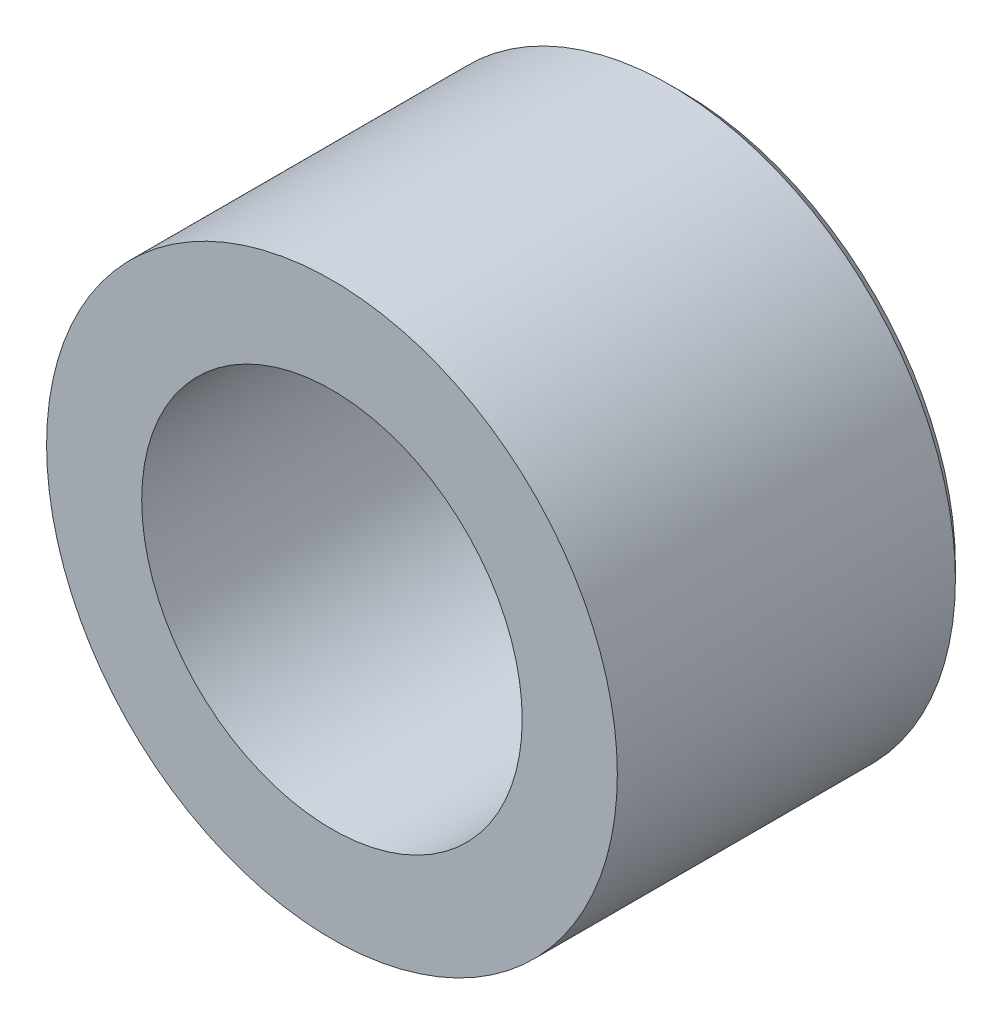
ISO-10303-21;
HEADER;
FILE_DESCRIPTION(('STEP AP214'),'2;1');
FILE_NAME('part.step','',(''),(''),'','','');
FILE_SCHEMA(('AUTOMOTIVE_DESIGN { 1 0 10303 214 1 1 1 1 }'));
ENDSEC;
DATA;
#1=APPLICATION_CONTEXT('core data for automotive mechanical design processes');
#2=APPLICATION_PROTOCOL_DEFINITION('international standard','automotive_design',2000,#1);
#3=PRODUCT_CONTEXT('',#1,'mechanical');
#4=PRODUCT('Part','Part','',(#3));
#5=PRODUCT_RELATED_PRODUCT_CATEGORY('part','',(#4));
#6=PRODUCT_DEFINITION_FORMATION('','',#4);
#7=PRODUCT_DEFINITION_CONTEXT('part definition',#1,'design');
#8=PRODUCT_DEFINITION('design','',#6,#7);
#9=PRODUCT_DEFINITION_SHAPE('','',#8);
#10=(LENGTH_UNIT() NAMED_UNIT(*) SI_UNIT(.MILLI.,.METRE.));
#11=(NAMED_UNIT(*) PLANE_ANGLE_UNIT() SI_UNIT($,.RADIAN.));
#12=(NAMED_UNIT(*) SI_UNIT($,.STERADIAN.) SOLID_ANGLE_UNIT());
#13=UNCERTAINTY_MEASURE_WITH_UNIT(LENGTH_MEASURE(1.E-05),#10,'distance_accuracy_value','');
#14=(GEOMETRIC_REPRESENTATION_CONTEXT(3) GLOBAL_UNCERTAINTY_ASSIGNED_CONTEXT((#13)) GLOBAL_UNIT_ASSIGNED_CONTEXT((#10,
#11,#12)) REPRESENTATION_CONTEXT('',''));
#15=CARTESIAN_POINT('',(0.,0.,0.));
#16=DIRECTION('',(0.,0.,1.));
#17=DIRECTION('',(1.,0.,0.));
#18=AXIS2_PLACEMENT_3D('',#15,#16,#17);
#19=CARTESIAN_POINT('',(0.,0.,5.842));
#20=DIRECTION('',(0.,0.,1.));
#21=DIRECTION('',(1.,0.,0.));
#22=AXIS2_PLACEMENT_3D('',#19,#20,#21);
#23=PLANE('',#22);
#24=CARTESIAN_POINT('',(0.,0.,5.842));
#25=DIRECTION('',(0.,0.,1.));
#26=DIRECTION('',(1.,0.,0.));
#27=AXIS2_PLACEMENT_3D('',#24,#25,#26);
#28=CIRCLE('',#27,4.7625);
#29=CARTESIAN_POINT('',(4.7625,0.,5.842));
#30=VERTEX_POINT('',#29);
#31=EDGE_CURVE('E51',#30,#30,#28,.T.);
#32=ORIENTED_EDGE('',*,*,#31,.T.);
#33=EDGE_LOOP('',(#32));
#34=FACE_BOUND('',#33,.T.);
#35=CARTESIAN_POINT('',(0.,0.,5.842));
#36=DIRECTION('',(0.,0.,1.));
#37=DIRECTION('',(1.,0.,0.));
#38=AXIS2_PLACEMENT_3D('',#35,#36,#37);
#39=CIRCLE('',#38,3.175);
#40=CARTESIAN_POINT('',(3.175,0.,5.842));
#41=VERTEX_POINT('',#40);
#42=EDGE_CURVE('E54',#41,#41,#39,.T.);
#43=ORIENTED_EDGE('',*,*,#42,.F.);
#44=EDGE_LOOP('',(#43));
#45=FACE_BOUND('',#44,.T.);
#46=ADVANCED_FACE('F31',(#34,#45),#23,.T.);
#47=CARTESIAN_POINT('',(0.,0.,0.));
#48=DIRECTION('',(0.,0.,1.));
#49=DIRECTION('',(1.,0.,0.));
#50=AXIS2_PLACEMENT_3D('',#47,#48,#49);
#51=PLANE('',#50);
#52=CARTESIAN_POINT('',(0.,0.,0.));
#53=DIRECTION('',(0.,0.,1.));
#54=DIRECTION('',(1.,0.,0.));
#55=AXIS2_PLACEMENT_3D('',#52,#53,#54);
#56=CIRCLE('',#55,4.5625);
#57=CARTESIAN_POINT('',(4.5625,0.,0.));
#58=VERTEX_POINT('',#57);
#59=EDGE_CURVE('E10',#58,#58,#56,.F.);
#60=ORIENTED_EDGE('',*,*,#59,.T.);
#61=EDGE_LOOP('',(#60));
#62=FACE_BOUND('',#61,.T.);
#63=CARTESIAN_POINT('',(0.,0.,0.));
#64=DIRECTION('',(0.,0.,1.));
#65=DIRECTION('',(1.,0.,0.));
#66=AXIS2_PLACEMENT_3D('',#63,#64,#65);
#67=CIRCLE('',#66,3.575);
#68=CARTESIAN_POINT('',(3.575,0.,0.));
#69=VERTEX_POINT('',#68);
#70=EDGE_CURVE('E46',#69,#69,#67,.T.);
#71=ORIENTED_EDGE('',*,*,#70,.T.);
#72=EDGE_LOOP('',(#71));
#73=FACE_BOUND('',#72,.T.);
#74=ADVANCED_FACE('F61',(#62,#73),#51,.F.);
#75=CARTESIAN_POINT('',(0.,0.,5.842));
#76=DIRECTION('',(0.,0.,-1.));
#77=DIRECTION('',(-1.,0.,0.));
#78=AXIS2_PLACEMENT_3D('',#75,#76,#77);
#79=CYLINDRICAL_SURFACE('',#78,4.7625);
#80=CARTESIAN_POINT('',(0.,0.,0.199999999999998));
#81=DIRECTION('',(0.,0.,1.));
#82=DIRECTION('',(1.,0.,0.));
#83=AXIS2_PLACEMENT_3D('',#80,#81,#82);
#84=CIRCLE('',#83,4.7625);
#85=CARTESIAN_POINT('',(4.7625,0.,0.199999999999998));
#86=VERTEX_POINT('',#85);
#87=EDGE_CURVE('E38',#86,#86,#84,.T.);
#88=ORIENTED_EDGE('',*,*,#87,.T.);
#89=EDGE_LOOP('',(#88));
#90=FACE_BOUND('',#89,.T.);
#91=ORIENTED_EDGE('',*,*,#31,.F.);
#92=EDGE_LOOP('',(#91));
#93=FACE_BOUND('',#92,.T.);
#94=ADVANCED_FACE('F67',(#90,#93),#79,.T.);
#95=CARTESIAN_POINT('',(0.,0.,5.842));
#96=DIRECTION('',(0.,0.,-1.));
#97=DIRECTION('',(-1.,0.,0.));
#98=AXIS2_PLACEMENT_3D('',#95,#96,#97);
#99=CYLINDRICAL_SURFACE('',#98,3.175);
#100=CARTESIAN_POINT('',(0.,0.,0.4));
#101=DIRECTION('',(0.,0.,1.));
#102=DIRECTION('',(1.,0.,0.));
#103=AXIS2_PLACEMENT_3D('',#100,#101,#102);
#104=CIRCLE('',#103,3.175);
#105=CARTESIAN_POINT('',(3.175,0.,0.4));
#106=VERTEX_POINT('',#105);
#107=EDGE_CURVE('E42',#106,#106,#104,.F.);
#108=ORIENTED_EDGE('',*,*,#107,.T.);
#109=EDGE_LOOP('',(#108));
#110=FACE_BOUND('',#109,.T.);
#111=ORIENTED_EDGE('',*,*,#42,.T.);
#112=EDGE_LOOP('',(#111));
#113=FACE_BOUND('',#112,.T.);
#114=ADVANCED_FACE('F58',(#110,#113),#99,.F.);
#115=CARTESIAN_POINT('',(0.,0.,0.));
#116=DIRECTION('',(0.,0.,-1.));
#117=DIRECTION('',(-1.,0.,0.));
#118=AXIS2_PLACEMENT_3D('',#115,#116,#117);
#119=CONICAL_SURFACE('',#118,3.575,0.785398163397446);
#120=ORIENTED_EDGE('',*,*,#107,.F.);
#121=EDGE_LOOP('',(#120));
#122=FACE_BOUND('',#121,.T.);
#123=ORIENTED_EDGE('',*,*,#70,.F.);
#124=EDGE_LOOP('',(#123));
#125=FACE_BOUND('',#124,.T.);
#126=ADVANCED_FACE('F72',(#122,#125),#119,.F.);
#127=CARTESIAN_POINT('',(0.,0.,0.199999999999998));
#128=DIRECTION('',(0.,0.,1.));
#129=DIRECTION('',(1.,0.,0.));
#130=AXIS2_PLACEMENT_3D('',#127,#128,#129);
#131=CONICAL_SURFACE('',#130,4.7625,0.785398163397453);
#132=ORIENTED_EDGE('',*,*,#59,.F.);
#133=EDGE_LOOP('',(#132));
#134=FACE_BOUND('',#133,.T.);
#135=ORIENTED_EDGE('',*,*,#87,.F.);
#136=EDGE_LOOP('',(#135));
#137=FACE_BOUND('',#136,.T.);
#138=ADVANCED_FACE('F33',(#134,#137),#131,.T.);
#139=CLOSED_SHELL('',(#46,#74,#94,#114,#126,#138));
#140=MANIFOLD_SOLID_BREP('B2',#139);
#141=ADVANCED_BREP_SHAPE_REPRESENTATION('',(#18,#140),#14);
#142=SHAPE_DEFINITION_REPRESENTATION(#9,#141);
ENDSEC;
END-ISO-10303-21;
